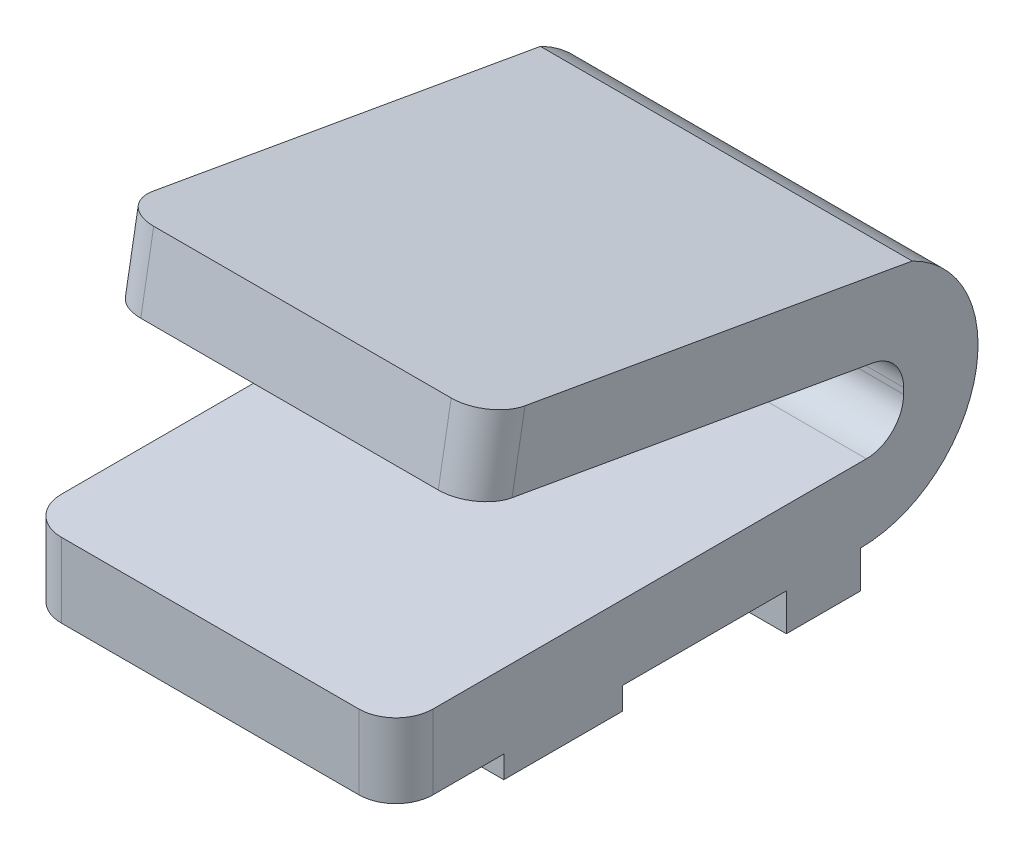
ISO-10303-21;
HEADER;
FILE_DESCRIPTION(('STEP AP214'),'2;1');
FILE_NAME('part.step','',(''),(''),'','','');
FILE_SCHEMA(('AUTOMOTIVE_DESIGN { 1 0 10303 214 1 1 1 1 }'));
ENDSEC;
DATA;
#1=APPLICATION_CONTEXT('core data for automotive mechanical design processes');
#2=APPLICATION_PROTOCOL_DEFINITION('international standard','automotive_design',2000,#1);
#3=PRODUCT_CONTEXT('',#1,'mechanical');
#4=PRODUCT('Part','Part','',(#3));
#5=PRODUCT_RELATED_PRODUCT_CATEGORY('part','',(#4));
#6=PRODUCT_DEFINITION_FORMATION('','',#4);
#7=PRODUCT_DEFINITION_CONTEXT('part definition',#1,'design');
#8=PRODUCT_DEFINITION('design','',#6,#7);
#9=PRODUCT_DEFINITION_SHAPE('','',#8);
#10=(LENGTH_UNIT() NAMED_UNIT(*) SI_UNIT(.MILLI.,.METRE.));
#11=(NAMED_UNIT(*) PLANE_ANGLE_UNIT() SI_UNIT($,.RADIAN.));
#12=(NAMED_UNIT(*) SI_UNIT($,.STERADIAN.) SOLID_ANGLE_UNIT());
#13=UNCERTAINTY_MEASURE_WITH_UNIT(LENGTH_MEASURE(1.E-05),#10,'distance_accuracy_value','');
#14=(GEOMETRIC_REPRESENTATION_CONTEXT(3) GLOBAL_UNCERTAINTY_ASSIGNED_CONTEXT((#13)) GLOBAL_UNIT_ASSIGNED_CONTEXT((#10,
#11,#12)) REPRESENTATION_CONTEXT('',''));
#15=CARTESIAN_POINT('',(0.,0.,0.));
#16=DIRECTION('',(0.,0.,1.));
#17=DIRECTION('',(1.,0.,0.));
#18=AXIS2_PLACEMENT_3D('',#15,#16,#17);
#19=CARTESIAN_POINT('',(5.,0.,4.8));
#20=DIRECTION('',(0.,0.,-1.));
#21=DIRECTION('',(-1.,0.,0.));
#22=AXIS2_PLACEMENT_3D('',#19,#20,#21);
#23=PLANE('',#22);
#24=DIRECTION('',(-1.,0.,0.));
#25=VECTOR('',#24,1.);
#26=CARTESIAN_POINT('',(5.,-0.3,4.8));
#27=LINE('',#26,#25);
#28=CARTESIAN_POINT('',(1.7,-0.3,4.8));
#29=VERTEX_POINT('',#28);
#30=CARTESIAN_POINT('',(0.,-0.3,4.8));
#31=VERTEX_POINT('',#30);
#32=EDGE_CURVE('E229',#29,#31,#27,.T.);
#33=ORIENTED_EDGE('',*,*,#32,.F.);
#34=DIRECTION('',(0.,-1.,0.));
#35=VECTOR('',#34,1.);
#36=CARTESIAN_POINT('',(1.7,2.26274169979695,4.8));
#37=LINE('',#36,#35);
#38=CARTESIAN_POINT('',(1.7,0.,4.8));
#39=VERTEX_POINT('',#38);
#40=EDGE_CURVE('E206',#39,#29,#37,.T.);
#41=ORIENTED_EDGE('',*,*,#40,.F.);
#42=DIRECTION('',(-1.,0.,0.));
#43=VECTOR('',#42,1.);
#44=CARTESIAN_POINT('',(5.,0.,4.8));
#45=LINE('',#44,#43);
#46=CARTESIAN_POINT('',(0.,0.,4.8));
#47=VERTEX_POINT('',#46);
#48=EDGE_CURVE('E237',#39,#47,#45,.T.);
#49=ORIENTED_EDGE('',*,*,#48,.T.);
#50=DIRECTION('',(0.,-1.,0.));
#51=VECTOR('',#50,1.);
#52=CARTESIAN_POINT('',(0.,0.,4.8));
#53=LINE('',#52,#51);
#54=EDGE_CURVE('E396',#47,#31,#53,.T.);
#55=ORIENTED_EDGE('',*,*,#54,.T.);
#56=EDGE_LOOP('',(#33,#41,#49,#55));
#57=FACE_BOUND('',#56,.T.);
#58=ADVANCED_FACE('F34',(#57),#23,.F.);
#59=CARTESIAN_POINT('',(5.,-0.3,0.));
#60=DIRECTION('',(0.,1.,0.));
#61=DIRECTION('',(0.,0.,1.));
#62=AXIS2_PLACEMENT_3D('',#59,#60,#61);
#63=PLANE('',#62);
#64=DIRECTION('',(-1.,0.,0.));
#65=VECTOR('',#64,1.);
#66=CARTESIAN_POINT('',(5.,-0.3,3.2));
#67=LINE('',#66,#65);
#68=CARTESIAN_POINT('',(1.7,-0.3,3.2));
#69=VERTEX_POINT('',#68);
#70=CARTESIAN_POINT('',(0.,-0.3,3.2));
#71=VERTEX_POINT('',#70);
#72=EDGE_CURVE('E216',#69,#71,#67,.T.);
#73=ORIENTED_EDGE('',*,*,#72,.F.);
#74=DIRECTION('',(0.,0.,-1.));
#75=VECTOR('',#74,1.);
#76=CARTESIAN_POINT('',(1.7,-0.3,4.8));
#77=LINE('',#76,#75);
#78=EDGE_CURVE('E200',#29,#69,#77,.T.);
#79=ORIENTED_EDGE('',*,*,#78,.F.);
#80=ORIENTED_EDGE('',*,*,#32,.T.);
#81=DIRECTION('',(0.,0.,-1.));
#82=VECTOR('',#81,1.);
#83=CARTESIAN_POINT('',(0.,-0.3,0.));
#84=LINE('',#83,#82);
#85=EDGE_CURVE('E223',#31,#71,#84,.T.);
#86=ORIENTED_EDGE('',*,*,#85,.T.);
#87=EDGE_LOOP('',(#73,#79,#80,#86));
#88=FACE_BOUND('',#87,.T.);
#89=ADVANCED_FACE('F221',(#88),#63,.F.);
#90=CARTESIAN_POINT('',(5.,0.,3.2));
#91=DIRECTION('',(0.,0.,-1.));
#92=DIRECTION('',(-1.,0.,0.));
#93=AXIS2_PLACEMENT_3D('',#90,#91,#92);
#94=PLANE('',#93);
#95=DIRECTION('',(0.,-1.,0.));
#96=VECTOR('',#95,1.);
#97=CARTESIAN_POINT('',(1.7,2.26274169979695,3.2));
#98=LINE('',#97,#96);
#99=CARTESIAN_POINT('',(1.7,0.,3.2));
#100=VERTEX_POINT('',#99);
#101=EDGE_CURVE('E203',#100,#69,#98,.T.);
#102=ORIENTED_EDGE('',*,*,#101,.T.);
#103=ORIENTED_EDGE('',*,*,#72,.T.);
#104=DIRECTION('',(0.,-1.,0.));
#105=VECTOR('',#104,1.);
#106=CARTESIAN_POINT('',(0.,0.,3.2));
#107=LINE('',#106,#105);
#108=CARTESIAN_POINT('',(0.,0.,3.2));
#109=VERTEX_POINT('',#108);
#110=EDGE_CURVE('E320',#109,#71,#107,.T.);
#111=ORIENTED_EDGE('',*,*,#110,.F.);
#112=DIRECTION('',(-1.,0.,0.));
#113=VECTOR('',#112,1.);
#114=CARTESIAN_POINT('',(5.,0.,3.2));
#115=LINE('',#114,#113);
#116=EDGE_CURVE('E218',#100,#109,#115,.T.);
#117=ORIENTED_EDGE('',*,*,#116,.F.);
#118=EDGE_LOOP('',(#102,#103,#111,#117));
#119=FACE_BOUND('',#118,.T.);
#120=ADVANCED_FACE('F214',(#119),#94,.T.);
#121=CARTESIAN_POINT('',(5.,0.,4.8));
#122=VERTEX_POINT('',#121);
#123=CARTESIAN_POINT('',(3.3,0.,4.8));
#124=VERTEX_POINT('',#123);
#125=EDGE_CURVE('E238',#122,#124,#45,.T.);
#126=ORIENTED_EDGE('',*,*,#125,.T.);
#127=DIRECTION('',(0.,-1.,0.));
#128=VECTOR('',#127,1.);
#129=CARTESIAN_POINT('',(3.3,2.26274169979695,4.8));
#130=LINE('',#129,#128);
#131=CARTESIAN_POINT('',(3.3,-0.3,4.8));
#132=VERTEX_POINT('',#131);
#133=EDGE_CURVE('E487',#124,#132,#130,.T.);
#134=ORIENTED_EDGE('',*,*,#133,.T.);
#135=CARTESIAN_POINT('',(5.,-0.3,4.8));
#136=VERTEX_POINT('',#135);
#137=EDGE_CURVE('E234',#136,#132,#27,.T.);
#138=ORIENTED_EDGE('',*,*,#137,.F.);
#139=DIRECTION('',(0.,-1.,0.));
#140=VECTOR('',#139,1.);
#141=CARTESIAN_POINT('',(5.,0.,4.8));
#142=LINE('',#141,#140);
#143=EDGE_CURVE('E353',#122,#136,#142,.T.);
#144=ORIENTED_EDGE('',*,*,#143,.F.);
#145=EDGE_LOOP('',(#126,#134,#138,#144));
#146=FACE_BOUND('',#145,.T.);
#147=ADVANCED_FACE('F468',(#146),#23,.F.);
#148=ORIENTED_EDGE('',*,*,#137,.T.);
#149=DIRECTION('',(0.,0.,1.));
#150=VECTOR('',#149,1.);
#151=CARTESIAN_POINT('',(3.3,-0.3,4.8));
#152=LINE('',#151,#150);
#153=CARTESIAN_POINT('',(3.3,-0.3,3.2));
#154=VERTEX_POINT('',#153);
#155=EDGE_CURVE('E210',#154,#132,#152,.T.);
#156=ORIENTED_EDGE('',*,*,#155,.F.);
#157=CARTESIAN_POINT('',(5.,-0.3,3.2));
#158=VERTEX_POINT('',#157);
#159=EDGE_CURVE('E225',#158,#154,#67,.T.);
#160=ORIENTED_EDGE('',*,*,#159,.F.);
#161=DIRECTION('',(0.,0.,-1.));
#162=VECTOR('',#161,1.);
#163=CARTESIAN_POINT('',(5.,-0.3,0.));
#164=LINE('',#163,#162);
#165=EDGE_CURVE('E356',#136,#158,#164,.T.);
#166=ORIENTED_EDGE('',*,*,#165,.F.);
#167=EDGE_LOOP('',(#148,#156,#160,#166));
#168=FACE_BOUND('',#167,.T.);
#169=ADVANCED_FACE('F473',(#168),#63,.F.);
#170=DIRECTION('',(0.,-1.,0.));
#171=VECTOR('',#170,1.);
#172=CARTESIAN_POINT('',(3.3,2.26274169979695,3.2));
#173=LINE('',#172,#171);
#174=CARTESIAN_POINT('',(3.3,0.,3.2));
#175=VERTEX_POINT('',#174);
#176=EDGE_CURVE('E219',#175,#154,#173,.T.);
#177=ORIENTED_EDGE('',*,*,#176,.F.);
#178=CARTESIAN_POINT('',(5.,0.,3.2));
#179=VERTEX_POINT('',#178);
#180=EDGE_CURVE('E226',#179,#175,#115,.T.);
#181=ORIENTED_EDGE('',*,*,#180,.F.);
#182=DIRECTION('',(0.,-1.,0.));
#183=VECTOR('',#182,1.);
#184=CARTESIAN_POINT('',(5.,0.,3.2));
#185=LINE('',#184,#183);
#186=EDGE_CURVE('E361',#179,#158,#185,.T.);
#187=ORIENTED_EDGE('',*,*,#186,.T.);
#188=ORIENTED_EDGE('',*,*,#159,.T.);
#189=EDGE_LOOP('',(#177,#181,#187,#188));
#190=FACE_BOUND('',#189,.T.);
#191=ADVANCED_FACE('F464',(#190),#94,.T.);
#192=CARTESIAN_POINT('',(5.,0.,0.));
#193=DIRECTION('',(0.,-1.,0.));
#194=DIRECTION('',(0.,0.,-1.));
#195=AXIS2_PLACEMENT_3D('',#192,#193,#194);
#196=PLANE('',#195);
#197=DIRECTION('',(-1.,0.,0.));
#198=VECTOR('',#197,1.);
#199=CARTESIAN_POINT('',(5.,0.,6.25));
#200=LINE('',#199,#198);
#201=CARTESIAN_POINT('',(4.5,0.,6.25));
#202=VERTEX_POINT('',#201);
#203=CARTESIAN_POINT('',(0.5,0.,6.25));
#204=VERTEX_POINT('',#203);
#205=EDGE_CURVE('E275',#202,#204,#200,.T.);
#206=ORIENTED_EDGE('',*,*,#205,.T.);
#207=CARTESIAN_POINT('',(0.5,0.,5.75));
#208=DIRECTION('',(0.,-1.,0.));
#209=DIRECTION('',(0.,0.,-1.));
#210=AXIS2_PLACEMENT_3D('',#207,#208,#209);
#211=CIRCLE('',#210,0.5);
#212=CARTESIAN_POINT('',(0.,0.,5.75));
#213=VERTEX_POINT('',#212);
#214=EDGE_CURVE('E11',#204,#213,#211,.T.);
#215=ORIENTED_EDGE('',*,*,#214,.T.);
#216=DIRECTION('',(0.,0.,1.));
#217=VECTOR('',#216,1.);
#218=CARTESIAN_POINT('',(0.,0.,0.));
#219=LINE('',#218,#217);
#220=EDGE_CURVE('E393',#47,#213,#219,.T.);
#221=ORIENTED_EDGE('',*,*,#220,.F.);
#222=ORIENTED_EDGE('',*,*,#48,.F.);
#223=DIRECTION('',(0.,0.,1.));
#224=VECTOR('',#223,1.);
#225=CARTESIAN_POINT('',(1.7,0.,4.8));
#226=LINE('',#225,#224);
#227=EDGE_CURVE('E319',#100,#39,#226,.T.);
#228=ORIENTED_EDGE('',*,*,#227,.F.);
#229=ORIENTED_EDGE('',*,*,#116,.T.);
#230=DIRECTION('',(0.,0.,1.));
#231=VECTOR('',#230,1.);
#232=CARTESIAN_POINT('',(0.,0.,0.));
#233=LINE('',#232,#231);
#234=CARTESIAN_POINT('',(0.,0.,1.));
#235=VERTEX_POINT('',#234);
#236=EDGE_CURVE('E317',#235,#109,#233,.T.);
#237=ORIENTED_EDGE('',*,*,#236,.F.);
#238=DIRECTION('',(-1.,0.,0.));
#239=VECTOR('',#238,1.);
#240=CARTESIAN_POINT('',(5.,0.,1.));
#241=LINE('',#240,#239);
#242=CARTESIAN_POINT('',(5.,0.,1.));
#243=VERTEX_POINT('',#242);
#244=EDGE_CURVE('E309',#243,#235,#241,.T.);
#245=ORIENTED_EDGE('',*,*,#244,.F.);
#246=DIRECTION('',(0.,0.,1.));
#247=VECTOR('',#246,1.);
#248=CARTESIAN_POINT('',(5.,0.,0.));
#249=LINE('',#248,#247);
#250=EDGE_CURVE('E364',#243,#179,#249,.T.);
#251=ORIENTED_EDGE('',*,*,#250,.T.);
#252=ORIENTED_EDGE('',*,*,#180,.T.);
#253=DIRECTION('',(0.,0.,-1.));
#254=VECTOR('',#253,1.);
#255=CARTESIAN_POINT('',(3.3,0.,4.8));
#256=LINE('',#255,#254);
#257=EDGE_CURVE('E488',#124,#175,#256,.T.);
#258=ORIENTED_EDGE('',*,*,#257,.F.);
#259=ORIENTED_EDGE('',*,*,#125,.F.);
#260=DIRECTION('',(0.,0.,1.));
#261=VECTOR('',#260,1.);
#262=CARTESIAN_POINT('',(5.,0.,0.));
#263=LINE('',#262,#261);
#264=CARTESIAN_POINT('',(5.,0.,5.75));
#265=VERTEX_POINT('',#264);
#266=EDGE_CURVE('E352',#122,#265,#263,.T.);
#267=ORIENTED_EDGE('',*,*,#266,.T.);
#268=CARTESIAN_POINT('',(4.5,0.,5.75));
#269=DIRECTION('',(0.,-1.,0.));
#270=DIRECTION('',(0.,0.,-1.));
#271=AXIS2_PLACEMENT_3D('',#268,#269,#270);
#272=CIRCLE('',#271,0.5);
#273=EDGE_CURVE('E42',#265,#202,#272,.T.);
#274=ORIENTED_EDGE('',*,*,#273,.T.);
#275=EDGE_LOOP('',(#206,#215,#221,#222,#228,#229,#237,#245,#251,#252,#258,#259,#267,#274));
#276=FACE_BOUND('',#275,.T.);
#277=ADVANCED_FACE('F315',(#276),#196,.T.);
#278=CARTESIAN_POINT('',(5.,0.,1.));
#279=DIRECTION('',(0.,0.,-1.));
#280=DIRECTION('',(-1.,0.,0.));
#281=AXIS2_PLACEMENT_3D('',#278,#279,#280);
#282=PLANE('',#281);
#283=DIRECTION('',(0.,-1.,0.));
#284=VECTOR('',#283,1.);
#285=CARTESIAN_POINT('',(0.,0.,1.));
#286=LINE('',#285,#284);
#287=CARTESIAN_POINT('',(0.,-0.5,1.));
#288=VERTEX_POINT('',#287);
#289=EDGE_CURVE('E326',#235,#288,#286,.T.);
#290=ORIENTED_EDGE('',*,*,#289,.T.);
#291=DIRECTION('',(-1.,0.,0.));
#292=VECTOR('',#291,1.);
#293=CARTESIAN_POINT('',(5.,-0.5,1.));
#294=LINE('',#293,#292);
#295=CARTESIAN_POINT('',(5.,-0.5,1.));
#296=VERTEX_POINT('',#295);
#297=EDGE_CURVE('E308',#296,#288,#294,.T.);
#298=ORIENTED_EDGE('',*,*,#297,.F.);
#299=DIRECTION('',(0.,-1.,0.));
#300=VECTOR('',#299,1.);
#301=CARTESIAN_POINT('',(5.,0.,1.));
#302=LINE('',#301,#300);
#303=EDGE_CURVE('E367',#243,#296,#302,.T.);
#304=ORIENTED_EDGE('',*,*,#303,.F.);
#305=ORIENTED_EDGE('',*,*,#244,.T.);
#306=EDGE_LOOP('',(#290,#298,#304,#305));
#307=FACE_BOUND('',#306,.T.);
#308=ADVANCED_FACE('F456',(#307),#282,.F.);
#309=CARTESIAN_POINT('',(5.,-0.5,0.));
#310=DIRECTION('',(0.,-1.,0.));
#311=DIRECTION('',(0.,0.,-1.));
#312=AXIS2_PLACEMENT_3D('',#309,#310,#311);
#313=PLANE('',#312);
#314=DIRECTION('',(0.,0.,1.));
#315=VECTOR('',#314,1.);
#316=CARTESIAN_POINT('',(0.,-0.5,0.));
#317=LINE('',#316,#315);
#318=CARTESIAN_POINT('',(0.,-0.5,0.));
#319=VERTEX_POINT('',#318);
#320=EDGE_CURVE('E328',#319,#288,#317,.T.);
#321=ORIENTED_EDGE('',*,*,#320,.F.);
#322=DIRECTION('',(-1.,0.,0.));
#323=VECTOR('',#322,1.);
#324=CARTESIAN_POINT('',(5.,-0.5,0.));
#325=LINE('',#324,#323);
#326=CARTESIAN_POINT('',(5.,-0.5,0.));
#327=VERTEX_POINT('',#326);
#328=EDGE_CURVE('E306',#327,#319,#325,.T.);
#329=ORIENTED_EDGE('',*,*,#328,.F.);
#330=DIRECTION('',(0.,0.,1.));
#331=VECTOR('',#330,1.);
#332=CARTESIAN_POINT('',(5.,-0.5,0.));
#333=LINE('',#332,#331);
#334=EDGE_CURVE('E369',#327,#296,#333,.T.);
#335=ORIENTED_EDGE('',*,*,#334,.T.);
#336=ORIENTED_EDGE('',*,*,#297,.T.);
#337=EDGE_LOOP('',(#321,#329,#335,#336));
#338=FACE_BOUND('',#337,.T.);
#339=ADVANCED_FACE('F454',(#338),#313,.T.);
#340=CARTESIAN_POINT('',(5.,0.,0.));
#341=DIRECTION('',(0.,0.,-1.));
#342=DIRECTION('',(0.,1.,0.));
#343=AXIS2_PLACEMENT_3D('',#340,#341,#342);
#344=PLANE('',#343);
#345=DIRECTION('',(0.,-1.,0.));
#346=VECTOR('',#345,1.);
#347=CARTESIAN_POINT('',(0.,0.,0.));
#348=LINE('',#347,#346);
#349=CARTESIAN_POINT('',(0.,0.,0.));
#350=VERTEX_POINT('',#349);
#351=EDGE_CURVE('E333',#350,#319,#348,.T.);
#352=ORIENTED_EDGE('',*,*,#351,.F.);
#353=DIRECTION('',(-1.,0.,0.));
#354=VECTOR('',#353,1.);
#355=CARTESIAN_POINT('',(5.,0.,0.));
#356=LINE('',#355,#354);
#357=CARTESIAN_POINT('',(5.,0.,0.));
#358=VERTEX_POINT('',#357);
#359=EDGE_CURVE('E304',#358,#350,#356,.T.);
#360=ORIENTED_EDGE('',*,*,#359,.F.);
#361=DIRECTION('',(0.,-1.,0.));
#362=VECTOR('',#361,1.);
#363=CARTESIAN_POINT('',(5.,0.,0.));
#364=LINE('',#363,#362);
#365=EDGE_CURVE('E372',#358,#327,#364,.T.);
#366=ORIENTED_EDGE('',*,*,#365,.T.);
#367=ORIENTED_EDGE('',*,*,#328,.T.);
#368=EDGE_LOOP('',(#352,#360,#366,#367));
#369=FACE_BOUND('',#368,.T.);
#370=ADVANCED_FACE('F451',(#369),#344,.T.);
#371=CARTESIAN_POINT('',(5.,1.57759117177541,0.));
#372=DIRECTION('',(-1.,0.,0.));
#373=DIRECTION('',(0.,0.,1.));
#374=AXIS2_PLACEMENT_3D('',#371,#372,#373);
#375=CYLINDRICAL_SURFACE('',#374,1.57759117177541);
#376=CARTESIAN_POINT('',(0.,1.57759117177541,0.));
#377=DIRECTION('',(1.,0.,0.));
#378=DIRECTION('',(0.,0.,-1.));
#379=AXIS2_PLACEMENT_3D('',#376,#377,#378);
#380=CIRCLE('',#379,1.57759117177541);
#381=CARTESIAN_POINT('',(0.,2.99489502839802,-0.692851847992352));
#382=VERTEX_POINT('',#381);
#383=EDGE_CURVE('E336',#350,#382,#380,.T.);
#384=ORIENTED_EDGE('',*,*,#383,.T.);
#385=DIRECTION('',(-1.,0.,0.));
#386=VECTOR('',#385,1.);
#387=CARTESIAN_POINT('',(5.,2.99489502839802,-0.692851847992352));
#388=LINE('',#387,#386);
#389=CARTESIAN_POINT('',(5.,2.99489502839802,-0.692851847992352));
#390=VERTEX_POINT('',#389);
#391=EDGE_CURVE('E301',#390,#382,#388,.T.);
#392=ORIENTED_EDGE('',*,*,#391,.F.);
#393=CARTESIAN_POINT('',(5.,1.57759117177541,0.));
#394=DIRECTION('',(1.,0.,0.));
#395=DIRECTION('',(0.,0.,-1.));
#396=AXIS2_PLACEMENT_3D('',#393,#394,#395);
#397=CIRCLE('',#396,1.57759117177541);
#398=EDGE_CURVE('E375',#358,#390,#397,.T.);
#399=ORIENTED_EDGE('',*,*,#398,.F.);
#400=ORIENTED_EDGE('',*,*,#359,.T.);
#401=EDGE_LOOP('',(#384,#392,#399,#400));
#402=FACE_BOUND('',#401,.T.);
#403=ADVANCED_FACE('F447',(#402),#375,.T.);
#404=CARTESIAN_POINT('',(5.,3.02307253748292,-0.533049252997022));
#405=DIRECTION('',(0.,0.984807753012209,-0.173648177666924));
#406=DIRECTION('',(0.,0.173648177666924,0.984807753012209));
#407=AXIS2_PLACEMENT_3D('',#404,#405,#406);
#408=PLANE('',#407);
#409=DIRECTION('',(0.,-0.173648177666924,-0.984807753012209));
#410=VECTOR('',#409,1.);
#411=CARTESIAN_POINT('',(0.,3.02307253748292,-0.533049252997022));
#412=LINE('',#411,#410);
#413=CARTESIAN_POINT('',(0.,3.91317591116654,4.51497782775545));
#414=VERTEX_POINT('',#413);
#415=EDGE_CURVE('E339',#414,#382,#412,.T.);
#416=ORIENTED_EDGE('',*,*,#415,.F.);
#417=CARTESIAN_POINT('',(0.5,3.91317591116654,4.51497782775545));
#418=DIRECTION('',(0.,0.984807753012209,-0.173648177666924));
#419=DIRECTION('',(0.,0.173648177666924,0.984807753012209));
#420=AXIS2_PLACEMENT_3D('',#417,#418,#419);
#421=CIRCLE('',#420,0.5);
#422=CARTESIAN_POINT('',(0.5,4.,5.00738170426155));
#423=VERTEX_POINT('',#422);
#424=EDGE_CURVE('E249',#414,#423,#421,.T.);
#425=ORIENTED_EDGE('',*,*,#424,.T.);
#426=DIRECTION('',(-1.,0.,0.));
#427=VECTOR('',#426,1.);
#428=CARTESIAN_POINT('',(5.,4.,5.00738170426155));
#429=LINE('',#428,#427);
#430=CARTESIAN_POINT('',(4.5,4.,5.00738170426155));
#431=VERTEX_POINT('',#430);
#432=EDGE_CURVE('E298',#431,#423,#429,.T.);
#433=ORIENTED_EDGE('',*,*,#432,.F.);
#434=CARTESIAN_POINT('',(4.5,3.91317591116654,4.51497782775545));
#435=DIRECTION('',(0.,0.984807753012209,-0.173648177666924));
#436=DIRECTION('',(0.,0.173648177666924,0.984807753012209));
#437=AXIS2_PLACEMENT_3D('',#434,#435,#436);
#438=CIRCLE('',#437,0.5);
#439=CARTESIAN_POINT('',(5.,3.91317591116654,4.51497782775545));
#440=VERTEX_POINT('',#439);
#441=EDGE_CURVE('E247',#431,#440,#438,.T.);
#442=ORIENTED_EDGE('',*,*,#441,.T.);
#443=DIRECTION('',(0.,-0.173648177666924,-0.984807753012209));
#444=VECTOR('',#443,1.);
#445=CARTESIAN_POINT('',(5.,3.02307253748292,-0.533049252997022));
#446=LINE('',#445,#444);
#447=EDGE_CURVE('E378',#440,#390,#446,.T.);
#448=ORIENTED_EDGE('',*,*,#447,.T.);
#449=ORIENTED_EDGE('',*,*,#391,.T.);
#450=EDGE_LOOP('',(#416,#425,#433,#442,#448,#449));
#451=FACE_BOUND('',#450,.T.);
#452=ADVANCED_FACE('F430',(#451),#408,.T.);
#453=CARTESIAN_POINT('',(5.,0.976927462517078,5.54043095725857));
#454=DIRECTION('',(0.,0.173648177666924,0.984807753012209));
#455=DIRECTION('',(0.,-0.984807753012209,0.173648177666924));
#456=AXIS2_PLACEMENT_3D('',#453,#454,#455);
#457=PLANE('',#456);
#458=ORIENTED_EDGE('',*,*,#432,.T.);
#459=DIRECTION('',(0.,0.984807753012209,-0.173648177666924));
#460=VECTOR('',#459,1.);
#461=CARTESIAN_POINT('',(0.5,3.01519224698779,5.18102988192848));
#462=LINE('',#461,#460);
#463=CARTESIAN_POINT('',(0.5,3.01519224698779,5.18102988192848));
#464=VERTEX_POINT('',#463);
#465=EDGE_CURVE('E254',#423,#464,#462,.F.);
#466=ORIENTED_EDGE('',*,*,#465,.T.);
#467=DIRECTION('',(-1.,0.,0.));
#468=VECTOR('',#467,1.);
#469=CARTESIAN_POINT('',(5.,3.01519224698779,5.18102988192848));
#470=LINE('',#469,#468);
#471=CARTESIAN_POINT('',(4.5,3.01519224698779,5.18102988192848));
#472=VERTEX_POINT('',#471);
#473=EDGE_CURVE('E295',#472,#464,#470,.T.);
#474=ORIENTED_EDGE('',*,*,#473,.F.);
#475=DIRECTION('',(0.,0.984807753012209,-0.173648177666924));
#476=VECTOR('',#475,1.);
#477=CARTESIAN_POINT('',(4.5,0.976927462517078,5.54043095725857));
#478=LINE('',#477,#476);
#479=EDGE_CURVE('E251',#472,#431,#478,.T.);
#480=ORIENTED_EDGE('',*,*,#479,.T.);
#481=EDGE_LOOP('',(#458,#466,#474,#480));
#482=FACE_BOUND('',#481,.T.);
#483=ADVANCED_FACE('F432',(#482),#457,.T.);
#484=CARTESIAN_POINT('',(5.,2.03826478447071,-0.359401075330097));
#485=DIRECTION('',(0.,-0.984807753012209,0.173648177666924));
#486=DIRECTION('',(0.,-0.173648177666924,-0.984807753012209));
#487=AXIS2_PLACEMENT_3D('',#484,#485,#486);
#488=PLANE('',#487);
#489=ORIENTED_EDGE('',*,*,#473,.T.);
#490=CARTESIAN_POINT('',(0.5,2.92836815815433,4.68862600542237));
#491=DIRECTION('',(0.,-0.984807753012209,0.173648177666924));
#492=DIRECTION('',(0.,-0.173648177666924,-0.984807753012209));
#493=AXIS2_PLACEMENT_3D('',#490,#491,#492);
#494=CIRCLE('',#493,0.5);
#495=CARTESIAN_POINT('',(0.,2.92836815815433,4.68862600542237));
#496=VERTEX_POINT('',#495);
#497=EDGE_CURVE('E258',#464,#496,#494,.T.);
#498=ORIENTED_EDGE('',*,*,#497,.T.);
#499=DIRECTION('',(0.,0.173648177666924,0.984807753012209));
#500=VECTOR('',#499,1.);
#501=CARTESIAN_POINT('',(0.,2.03826478447071,-0.359401075330097));
#502=LINE('',#501,#500);
#503=CARTESIAN_POINT('',(0.,2.07285406091746,-0.163235540663921));
#504=VERTEX_POINT('',#503);
#505=EDGE_CURVE('E341',#504,#496,#502,.T.);
#506=ORIENTED_EDGE('',*,*,#505,.F.);
#507=DIRECTION('',(-1.,0.,0.));
#508=VECTOR('',#507,1.);
#509=CARTESIAN_POINT('',(5.,2.07285406091746,-0.163235540663921));
#510=LINE('',#509,#508);
#511=CARTESIAN_POINT('',(5.,2.07285406091746,-0.163235540663921));
#512=VERTEX_POINT('',#511);
#513=EDGE_CURVE('E293',#512,#504,#510,.T.);
#514=ORIENTED_EDGE('',*,*,#513,.F.);
#515=DIRECTION('',(0.,0.173648177666924,0.984807753012209));
#516=VECTOR('',#515,1.);
#517=CARTESIAN_POINT('',(5.,2.03826478447071,-0.359401075330097));
#518=LINE('',#517,#516);
#519=CARTESIAN_POINT('',(5.,2.92836815815433,4.68862600542237));
#520=VERTEX_POINT('',#519);
#521=EDGE_CURVE('E380',#512,#520,#518,.T.);
#522=ORIENTED_EDGE('',*,*,#521,.T.);
#523=CARTESIAN_POINT('',(4.5,2.92836815815433,4.68862600542237));
#524=DIRECTION('',(0.,-0.984807753012209,0.173648177666924));
#525=DIRECTION('',(0.,-0.173648177666924,-0.984807753012209));
#526=AXIS2_PLACEMENT_3D('',#523,#524,#525);
#527=CIRCLE('',#526,0.5);
#528=EDGE_CURVE('E256',#520,#472,#527,.T.);
#529=ORIENTED_EDGE('',*,*,#528,.T.);
#530=EDGE_LOOP('',(#489,#498,#506,#514,#522,#529));
#531=FACE_BOUND('',#530,.T.);
#532=ADVANCED_FACE('F421',(#531),#488,.T.);
#533=CARTESIAN_POINT('',(5.,1.58045018441136,-0.0764114518304592));
#534=DIRECTION('',(-1.,0.,0.));
#535=DIRECTION('',(0.,0.,1.));
#536=AXIS2_PLACEMENT_3D('',#533,#534,#535);
#537=CYLINDRICAL_SURFACE('',#536,0.5);
#538=CARTESIAN_POINT('',(0.,1.58045018441136,-0.0764114518304592));
#539=DIRECTION('',(1.,0.,0.));
#540=DIRECTION('',(0.,0.,-1.));
#541=AXIS2_PLACEMENT_3D('',#538,#539,#540);
#542=CIRCLE('',#541,0.5);
#543=CARTESIAN_POINT('',(0.,1.58045018441136,-0.576411451830459));
#544=VERTEX_POINT('',#543);
#545=EDGE_CURVE('E343',#544,#504,#542,.T.);
#546=ORIENTED_EDGE('',*,*,#545,.F.);
#547=DIRECTION('',(-1.,0.,0.));
#548=VECTOR('',#547,1.);
#549=CARTESIAN_POINT('',(5.,1.58045018441136,-0.576411451830459));
#550=LINE('',#549,#548);
#551=CARTESIAN_POINT('',(5.,1.58045018441136,-0.576411451830459));
#552=VERTEX_POINT('',#551);
#553=EDGE_CURVE('E291',#552,#544,#550,.T.);
#554=ORIENTED_EDGE('',*,*,#553,.F.);
#555=CARTESIAN_POINT('',(5.,1.58045018441136,-0.0764114518304592));
#556=DIRECTION('',(1.,0.,0.));
#557=DIRECTION('',(0.,0.,-1.));
#558=AXIS2_PLACEMENT_3D('',#555,#556,#557);
#559=CIRCLE('',#558,0.5);
#560=EDGE_CURVE('E383',#552,#512,#559,.T.);
#561=ORIENTED_EDGE('',*,*,#560,.T.);
#562=ORIENTED_EDGE('',*,*,#513,.T.);
#563=EDGE_LOOP('',(#546,#554,#561,#562));
#564=FACE_BOUND('',#563,.T.);
#565=ADVANCED_FACE('F417',(#564),#537,.F.);
#566=CARTESIAN_POINT('',(5.,0.,-0.576411451830459));
#567=DIRECTION('',(0.,0.,1.));
#568=DIRECTION('',(1.,0.,0.));
#569=AXIS2_PLACEMENT_3D('',#566,#567,#568);
#570=PLANE('',#569);
#571=DIRECTION('',(0.,1.,0.));
#572=VECTOR('',#571,1.);
#573=CARTESIAN_POINT('',(0.,0.,-0.576411451830459));
#574=LINE('',#573,#572);
#575=CARTESIAN_POINT('',(0.,1.5,-0.576411451830459));
#576=VERTEX_POINT('',#575);
#577=EDGE_CURVE('E346',#576,#544,#574,.T.);
#578=ORIENTED_EDGE('',*,*,#577,.F.);
#579=DIRECTION('',(-1.,0.,0.));
#580=VECTOR('',#579,1.);
#581=CARTESIAN_POINT('',(5.,1.5,-0.576411451830459));
#582=LINE('',#581,#580);
#583=CARTESIAN_POINT('',(5.,1.5,-0.576411451830459));
#584=VERTEX_POINT('',#583);
#585=EDGE_CURVE('E284',#584,#576,#582,.T.);
#586=ORIENTED_EDGE('',*,*,#585,.F.);
#587=DIRECTION('',(0.,1.,0.));
#588=VECTOR('',#587,1.);
#589=CARTESIAN_POINT('',(5.,0.,-0.576411451830459));
#590=LINE('',#589,#588);
#591=EDGE_CURVE('E386',#584,#552,#590,.T.);
#592=ORIENTED_EDGE('',*,*,#591,.T.);
#593=ORIENTED_EDGE('',*,*,#553,.T.);
#594=EDGE_LOOP('',(#578,#586,#592,#593));
#595=FACE_BOUND('',#594,.T.);
#596=ADVANCED_FACE('F413',(#595),#570,.T.);
#597=CARTESIAN_POINT('',(5.,1.5,-0.0764114518304593));
#598=DIRECTION('',(-1.,0.,0.));
#599=DIRECTION('',(0.,0.,1.));
#600=AXIS2_PLACEMENT_3D('',#597,#598,#599);
#601=CYLINDRICAL_SURFACE('',#600,0.5);
#602=CARTESIAN_POINT('',(0.,1.5,-0.0764114518304593));
#603=DIRECTION('',(1.,0.,0.));
#604=DIRECTION('',(0.,0.,-1.));
#605=AXIS2_PLACEMENT_3D('',#602,#603,#604);
#606=CIRCLE('',#605,0.5);
#607=CARTESIAN_POINT('',(0.,1.,-0.0764114518304593));
#608=VERTEX_POINT('',#607);
#609=EDGE_CURVE('E349',#608,#576,#606,.T.);
#610=ORIENTED_EDGE('',*,*,#609,.F.);
#611=DIRECTION('',(-1.,0.,0.));
#612=VECTOR('',#611,1.);
#613=CARTESIAN_POINT('',(5.,1.,-0.0764114518304593));
#614=LINE('',#613,#612);
#615=CARTESIAN_POINT('',(5.,1.,-0.0764114518304593));
#616=VERTEX_POINT('',#615);
#617=EDGE_CURVE('E281',#616,#608,#614,.T.);
#618=ORIENTED_EDGE('',*,*,#617,.F.);
#619=CARTESIAN_POINT('',(5.,1.5,-0.0764114518304593));
#620=DIRECTION('',(1.,0.,0.));
#621=DIRECTION('',(0.,0.,-1.));
#622=AXIS2_PLACEMENT_3D('',#619,#620,#621);
#623=CIRCLE('',#622,0.5);
#624=EDGE_CURVE('E389',#616,#584,#623,.T.);
#625=ORIENTED_EDGE('',*,*,#624,.T.);
#626=ORIENTED_EDGE('',*,*,#585,.T.);
#627=EDGE_LOOP('',(#610,#618,#625,#626));
#628=FACE_BOUND('',#627,.T.);
#629=ADVANCED_FACE('F409',(#628),#601,.F.);
#630=CARTESIAN_POINT('',(5.,1.,0.));
#631=DIRECTION('',(0.,1.,0.));
#632=DIRECTION('',(0.,0.,1.));
#633=AXIS2_PLACEMENT_3D('',#630,#631,#632);
#634=PLANE('',#633);
#635=DIRECTION('',(0.,0.,-1.));
#636=VECTOR('',#635,1.);
#637=CARTESIAN_POINT('',(0.,1.,0.));
#638=LINE('',#637,#636);
#639=CARTESIAN_POINT('',(0.,0.999999999999999,5.75));
#640=VERTEX_POINT('',#639);
#641=EDGE_CURVE('E351',#640,#608,#638,.T.);
#642=ORIENTED_EDGE('',*,*,#641,.F.);
#643=CARTESIAN_POINT('',(0.5,0.999999999999999,5.75));
#644=DIRECTION('',(0.,1.,0.));
#645=DIRECTION('',(0.,0.,1.));
#646=AXIS2_PLACEMENT_3D('',#643,#644,#645);
#647=CIRCLE('',#646,0.5);
#648=CARTESIAN_POINT('',(0.5,0.999999999999999,6.25));
#649=VERTEX_POINT('',#648);
#650=EDGE_CURVE('E266',#640,#649,#647,.T.);
#651=ORIENTED_EDGE('',*,*,#650,.T.);
#652=DIRECTION('',(-1.,0.,0.));
#653=VECTOR('',#652,1.);
#654=CARTESIAN_POINT('',(5.,0.999999999999999,6.25));
#655=LINE('',#654,#653);
#656=CARTESIAN_POINT('',(4.5,0.999999999999999,6.25));
#657=VERTEX_POINT('',#656);
#658=EDGE_CURVE('E274',#657,#649,#655,.T.);
#659=ORIENTED_EDGE('',*,*,#658,.F.);
#660=CARTESIAN_POINT('',(4.5,0.999999999999999,5.75));
#661=DIRECTION('',(0.,1.,0.));
#662=DIRECTION('',(0.,0.,1.));
#663=AXIS2_PLACEMENT_3D('',#660,#661,#662);
#664=CIRCLE('',#663,0.5);
#665=CARTESIAN_POINT('',(5.,0.999999999999999,5.75));
#666=VERTEX_POINT('',#665);
#667=EDGE_CURVE('E264',#657,#666,#664,.T.);
#668=ORIENTED_EDGE('',*,*,#667,.T.);
#669=DIRECTION('',(0.,0.,-1.));
#670=VECTOR('',#669,1.);
#671=CARTESIAN_POINT('',(5.,1.,0.));
#672=LINE('',#671,#670);
#673=EDGE_CURVE('E286',#666,#616,#672,.T.);
#674=ORIENTED_EDGE('',*,*,#673,.T.);
#675=ORIENTED_EDGE('',*,*,#617,.T.);
#676=EDGE_LOOP('',(#642,#651,#659,#668,#674,#675));
#677=FACE_BOUND('',#676,.T.);
#678=ADVANCED_FACE('F279',(#677),#634,.T.);
#679=CARTESIAN_POINT('',(5.,0.,6.25));
#680=DIRECTION('',(0.,0.,1.));
#681=DIRECTION('',(1.,0.,0.));
#682=AXIS2_PLACEMENT_3D('',#679,#680,#681);
#683=PLANE('',#682);
#684=ORIENTED_EDGE('',*,*,#658,.T.);
#685=DIRECTION('',(0.,1.,0.));
#686=VECTOR('',#685,1.);
#687=CARTESIAN_POINT('',(0.5,0.,6.25));
#688=LINE('',#687,#686);
#689=EDGE_CURVE('E49',#649,#204,#688,.F.);
#690=ORIENTED_EDGE('',*,*,#689,.T.);
#691=ORIENTED_EDGE('',*,*,#205,.F.);
#692=DIRECTION('',(0.,1.,0.));
#693=VECTOR('',#692,1.);
#694=CARTESIAN_POINT('',(4.5,0.,6.25));
#695=LINE('',#694,#693);
#696=EDGE_CURVE('E268',#202,#657,#695,.T.);
#697=ORIENTED_EDGE('',*,*,#696,.T.);
#698=EDGE_LOOP('',(#684,#690,#691,#697));
#699=FACE_BOUND('',#698,.T.);
#700=ADVANCED_FACE('F273',(#699),#683,.T.);
#701=CARTESIAN_POINT('',(5.,0.,0.));
#702=DIRECTION('',(1.,0.,0.));
#703=DIRECTION('',(0.,0.,-1.));
#704=AXIS2_PLACEMENT_3D('',#701,#702,#703);
#705=PLANE('',#704);
#706=ORIENTED_EDGE('',*,*,#447,.F.);
#707=DIRECTION('',(0.,0.984807753012209,-0.173648177666924));
#708=VECTOR('',#707,1.);
#709=CARTESIAN_POINT('',(5.,0.890103373683616,5.04802708075247));
#710=LINE('',#709,#708);
#711=EDGE_CURVE('E262',#440,#520,#710,.F.);
#712=ORIENTED_EDGE('',*,*,#711,.T.);
#713=ORIENTED_EDGE('',*,*,#521,.F.);
#714=ORIENTED_EDGE('',*,*,#560,.F.);
#715=ORIENTED_EDGE('',*,*,#591,.F.);
#716=ORIENTED_EDGE('',*,*,#624,.F.);
#717=ORIENTED_EDGE('',*,*,#673,.F.);
#718=DIRECTION('',(0.,1.,0.));
#719=VECTOR('',#718,1.);
#720=CARTESIAN_POINT('',(5.,0.,5.75));
#721=LINE('',#720,#719);
#722=EDGE_CURVE('E260',#666,#265,#721,.F.);
#723=ORIENTED_EDGE('',*,*,#722,.T.);
#724=ORIENTED_EDGE('',*,*,#266,.F.);
#725=ORIENTED_EDGE('',*,*,#143,.T.);
#726=ORIENTED_EDGE('',*,*,#165,.T.);
#727=ORIENTED_EDGE('',*,*,#186,.F.);
#728=ORIENTED_EDGE('',*,*,#250,.F.);
#729=ORIENTED_EDGE('',*,*,#303,.T.);
#730=ORIENTED_EDGE('',*,*,#334,.F.);
#731=ORIENTED_EDGE('',*,*,#365,.F.);
#732=ORIENTED_EDGE('',*,*,#398,.T.);
#733=EDGE_LOOP('',(#706,#712,#713,#714,#715,#716,#717,#723,#724,#725,#726,#727,#728,#729,#730,
#731,#732));
#734=FACE_BOUND('',#733,.T.);
#735=ADVANCED_FACE('F441',(#734),#705,.T.);
#736=CARTESIAN_POINT('',(0.,0.,0.));
#737=DIRECTION('',(1.,0.,0.));
#738=DIRECTION('',(0.,0.,-1.));
#739=AXIS2_PLACEMENT_3D('',#736,#737,#738);
#740=PLANE('',#739);
#741=ORIENTED_EDGE('',*,*,#505,.T.);
#742=DIRECTION('',(0.,0.984807753012209,-0.173648177666924));
#743=VECTOR('',#742,1.);
#744=CARTESIAN_POINT('',(0.,3.91317591116654,4.51497782775545));
#745=LINE('',#744,#743);
#746=EDGE_CURVE('E244',#496,#414,#745,.T.);
#747=ORIENTED_EDGE('',*,*,#746,.T.);
#748=ORIENTED_EDGE('',*,*,#415,.T.);
#749=ORIENTED_EDGE('',*,*,#383,.F.);
#750=ORIENTED_EDGE('',*,*,#351,.T.);
#751=ORIENTED_EDGE('',*,*,#320,.T.);
#752=ORIENTED_EDGE('',*,*,#289,.F.);
#753=ORIENTED_EDGE('',*,*,#236,.T.);
#754=ORIENTED_EDGE('',*,*,#110,.T.);
#755=ORIENTED_EDGE('',*,*,#85,.F.);
#756=ORIENTED_EDGE('',*,*,#54,.F.);
#757=ORIENTED_EDGE('',*,*,#220,.T.);
#758=DIRECTION('',(0.,1.,0.));
#759=VECTOR('',#758,1.);
#760=CARTESIAN_POINT('',(0.,0.999999999999999,5.75));
#761=LINE('',#760,#759);
#762=EDGE_CURVE('E241',#213,#640,#761,.T.);
#763=ORIENTED_EDGE('',*,*,#762,.T.);
#764=ORIENTED_EDGE('',*,*,#641,.T.);
#765=ORIENTED_EDGE('',*,*,#609,.T.);
#766=ORIENTED_EDGE('',*,*,#577,.T.);
#767=ORIENTED_EDGE('',*,*,#545,.T.);
#768=EDGE_LOOP('',(#741,#747,#748,#749,#750,#751,#752,#753,#754,#755,#756,#757,#763,#764,#765,
#766,#767));
#769=FACE_BOUND('',#768,.T.);
#770=ADVANCED_FACE('F324',(#769),#740,.F.);
#771=CARTESIAN_POINT('',(1.7,2.26274169979695,4.8));
#772=DIRECTION('',(-1.,0.,0.));
#773=DIRECTION('',(0.,0.,1.));
#774=AXIS2_PLACEMENT_3D('',#771,#772,#773);
#775=PLANE('',#774);
#776=ORIENTED_EDGE('',*,*,#227,.T.);
#777=ORIENTED_EDGE('',*,*,#40,.T.);
#778=ORIENTED_EDGE('',*,*,#78,.T.);
#779=ORIENTED_EDGE('',*,*,#101,.F.);
#780=EDGE_LOOP('',(#776,#777,#778,#779));
#781=FACE_BOUND('',#780,.T.);
#782=ADVANCED_FACE('F202',(#781),#775,.F.);
#783=CARTESIAN_POINT('',(3.3,2.26274169979695,4.8));
#784=DIRECTION('',(1.,0.,0.));
#785=DIRECTION('',(0.,0.,-1.));
#786=AXIS2_PLACEMENT_3D('',#783,#784,#785);
#787=PLANE('',#786);
#788=ORIENTED_EDGE('',*,*,#257,.T.);
#789=ORIENTED_EDGE('',*,*,#176,.T.);
#790=ORIENTED_EDGE('',*,*,#155,.T.);
#791=ORIENTED_EDGE('',*,*,#133,.F.);
#792=EDGE_LOOP('',(#788,#789,#790,#791));
#793=FACE_BOUND('',#792,.T.);
#794=ADVANCED_FACE('F492',(#793),#787,.F.);
#795=CARTESIAN_POINT('',(0.5,0.890103373683616,5.04802708075247));
#796=DIRECTION('',(0.,-0.984807753012209,0.173648177666924));
#797=DIRECTION('',(0.,-0.173648177666924,-0.984807753012209));
#798=AXIS2_PLACEMENT_3D('',#795,#796,#797);
#799=CYLINDRICAL_SURFACE('',#798,0.5);
#800=ORIENTED_EDGE('',*,*,#497,.F.);
#801=ORIENTED_EDGE('',*,*,#465,.F.);
#802=ORIENTED_EDGE('',*,*,#424,.F.);
#803=ORIENTED_EDGE('',*,*,#746,.F.);
#804=EDGE_LOOP('',(#800,#801,#802,#803));
#805=FACE_BOUND('',#804,.T.);
#806=ADVANCED_FACE('F426',(#805),#799,.T.);
#807=CARTESIAN_POINT('',(4.5,0.890103373683616,5.04802708075247));
#808=DIRECTION('',(0.,0.984807753012209,-0.173648177666924));
#809=DIRECTION('',(0.,0.173648177666924,0.984807753012209));
#810=AXIS2_PLACEMENT_3D('',#807,#808,#809);
#811=CYLINDRICAL_SURFACE('',#810,0.5);
#812=ORIENTED_EDGE('',*,*,#528,.F.);
#813=ORIENTED_EDGE('',*,*,#711,.F.);
#814=ORIENTED_EDGE('',*,*,#441,.F.);
#815=ORIENTED_EDGE('',*,*,#479,.F.);
#816=EDGE_LOOP('',(#812,#813,#814,#815));
#817=FACE_BOUND('',#816,.T.);
#818=ADVANCED_FACE('F437',(#817),#811,.T.);
#819=CARTESIAN_POINT('',(0.5,0.,5.75));
#820=DIRECTION('',(0.,-1.,0.));
#821=DIRECTION('',(0.,0.,-1.));
#822=AXIS2_PLACEMENT_3D('',#819,#820,#821);
#823=CYLINDRICAL_SURFACE('',#822,0.5);
#824=ORIENTED_EDGE('',*,*,#214,.F.);
#825=ORIENTED_EDGE('',*,*,#689,.F.);
#826=ORIENTED_EDGE('',*,*,#650,.F.);
#827=ORIENTED_EDGE('',*,*,#762,.F.);
#828=EDGE_LOOP('',(#824,#825,#826,#827));
#829=FACE_BOUND('',#828,.T.);
#830=ADVANCED_FACE('F404',(#829),#823,.T.);
#831=CARTESIAN_POINT('',(4.5,0.,5.75));
#832=DIRECTION('',(0.,1.,0.));
#833=DIRECTION('',(0.,0.,1.));
#834=AXIS2_PLACEMENT_3D('',#831,#832,#833);
#835=CYLINDRICAL_SURFACE('',#834,0.5);
#836=ORIENTED_EDGE('',*,*,#273,.F.);
#837=ORIENTED_EDGE('',*,*,#722,.F.);
#838=ORIENTED_EDGE('',*,*,#667,.F.);
#839=ORIENTED_EDGE('',*,*,#696,.F.);
#840=EDGE_LOOP('',(#836,#837,#838,#839));
#841=FACE_BOUND('',#840,.T.);
#842=ADVANCED_FACE('F36',(#841),#835,.T.);
#843=CLOSED_SHELL('',(#58,#89,#120,#147,#169,#191,#277,#308,#339,#370,#403,#452,#483,#532,#565,
#596,#629,#678,#700,#735,#770,#782,#794,#806,#818,#830,#842));
#844=MANIFOLD_SOLID_BREP('B2',#843);
#845=ADVANCED_BREP_SHAPE_REPRESENTATION('',(#18,#844),#14);
#846=SHAPE_DEFINITION_REPRESENTATION(#9,#845);
ENDSEC;
END-ISO-10303-21;
